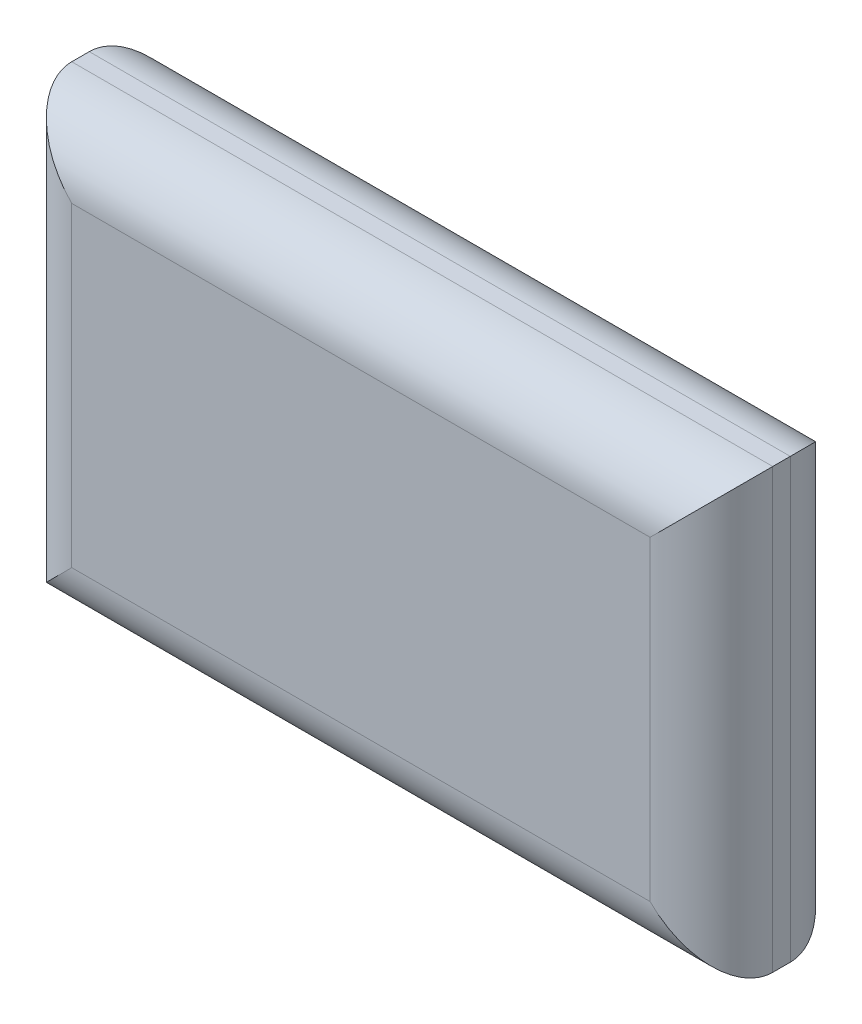
ISO-10303-21;
HEADER;
FILE_DESCRIPTION(('STEP AP214'),'2;1');
FILE_NAME('part.step','',(''),(''),'','','');
FILE_SCHEMA(('AUTOMOTIVE_DESIGN { 1 0 10303 214 1 1 1 1 }'));
ENDSEC;
DATA;
#1=APPLICATION_CONTEXT('core data for automotive mechanical design processes');
#2=APPLICATION_PROTOCOL_DEFINITION('international standard','automotive_design',2000,#1);
#3=PRODUCT_CONTEXT('',#1,'mechanical');
#4=PRODUCT('Part','Part','',(#3));
#5=PRODUCT_RELATED_PRODUCT_CATEGORY('part','',(#4));
#6=PRODUCT_DEFINITION_FORMATION('','',#4);
#7=PRODUCT_DEFINITION_CONTEXT('part definition',#1,'design');
#8=PRODUCT_DEFINITION('design','',#6,#7);
#9=PRODUCT_DEFINITION_SHAPE('','',#8);
#10=(LENGTH_UNIT() NAMED_UNIT(*) SI_UNIT(.MILLI.,.METRE.));
#11=(NAMED_UNIT(*) PLANE_ANGLE_UNIT() SI_UNIT($,.RADIAN.));
#12=(NAMED_UNIT(*) SI_UNIT($,.STERADIAN.) SOLID_ANGLE_UNIT());
#13=UNCERTAINTY_MEASURE_WITH_UNIT(LENGTH_MEASURE(1.E-05),#10,'distance_accuracy_value','');
#14=(GEOMETRIC_REPRESENTATION_CONTEXT(3) GLOBAL_UNCERTAINTY_ASSIGNED_CONTEXT((#13)) GLOBAL_UNIT_ASSIGNED_CONTEXT((#10,
#11,#12)) REPRESENTATION_CONTEXT('',''));
#15=CARTESIAN_POINT('',(0.,0.,0.));
#16=DIRECTION('',(0.,0.,1.));
#17=DIRECTION('',(1.,0.,0.));
#18=AXIS2_PLACEMENT_3D('',#15,#16,#17);
#19=CARTESIAN_POINT('',(20.,-12.5,8.));
#20=DIRECTION('',(-1.,0.,0.));
#21=DIRECTION('',(0.,0.,1.));
#22=AXIS2_PLACEMENT_3D('',#19,#20,#21);
#23=PLANE('',#22);
#24=DIRECTION('',(0.,0.,-1.));
#25=VECTOR('',#24,1.);
#26=CARTESIAN_POINT('',(20.,-12.5,8.));
#27=LINE('',#26,#25);
#28=CARTESIAN_POINT('',(20.,-12.5,4.5));
#29=VERTEX_POINT('',#28);
#30=CARTESIAN_POINT('',(20.,-12.5,3.5));
#31=VERTEX_POINT('',#30);
#32=EDGE_CURVE('E194',#29,#31,#27,.T.);
#33=ORIENTED_EDGE('',*,*,#32,.T.);
#34=DIRECTION('',(0.,1.,0.));
#35=VECTOR('',#34,1.);
#36=CARTESIAN_POINT('',(20.,12.5,3.5));
#37=LINE('',#36,#35);
#38=CARTESIAN_POINT('',(20.,12.5,3.5));
#39=VERTEX_POINT('',#38);
#40=EDGE_CURVE('E164',#31,#39,#37,.T.);
#41=ORIENTED_EDGE('',*,*,#40,.T.);
#42=DIRECTION('',(0.,0.,-1.));
#43=VECTOR('',#42,1.);
#44=CARTESIAN_POINT('',(20.,12.5,8.));
#45=LINE('',#44,#43);
#46=CARTESIAN_POINT('',(20.,12.5,4.5));
#47=VERTEX_POINT('',#46);
#48=EDGE_CURVE('E276',#47,#39,#45,.T.);
#49=ORIENTED_EDGE('',*,*,#48,.F.);
#50=DIRECTION('',(0.,1.,0.));
#51=VECTOR('',#50,1.);
#52=CARTESIAN_POINT('',(20.,-12.5,4.5));
#53=LINE('',#52,#51);
#54=EDGE_CURVE('E161',#47,#29,#53,.F.);
#55=ORIENTED_EDGE('',*,*,#54,.T.);
#56=EDGE_LOOP('',(#33,#41,#49,#55));
#57=FACE_BOUND('',#56,.T.);
#58=ADVANCED_FACE('F44',(#57),#23,.F.);
#59=CARTESIAN_POINT('',(-20.,12.5,8.));
#60=DIRECTION('',(0.,-1.,0.));
#61=DIRECTION('',(0.,0.,-1.));
#62=AXIS2_PLACEMENT_3D('',#59,#60,#61);
#63=PLANE('',#62);
#64=ORIENTED_EDGE('',*,*,#48,.T.);
#65=DIRECTION('',(-1.,0.,0.));
#66=VECTOR('',#65,1.);
#67=CARTESIAN_POINT('',(-20.,12.5,3.5));
#68=LINE('',#67,#66);
#69=CARTESIAN_POINT('',(-20.,12.5,3.5));
#70=VERTEX_POINT('',#69);
#71=EDGE_CURVE('E288',#39,#70,#68,.T.);
#72=ORIENTED_EDGE('',*,*,#71,.T.);
#73=DIRECTION('',(0.,0.,-1.));
#74=VECTOR('',#73,1.);
#75=CARTESIAN_POINT('',(-20.,12.5,8.));
#76=LINE('',#75,#74);
#77=CARTESIAN_POINT('',(-20.,12.5,4.5));
#78=VERTEX_POINT('',#77);
#79=EDGE_CURVE('E271',#78,#70,#76,.T.);
#80=ORIENTED_EDGE('',*,*,#79,.F.);
#81=DIRECTION('',(-1.,0.,0.));
#82=VECTOR('',#81,1.);
#83=CARTESIAN_POINT('',(-20.,12.5,4.5));
#84=LINE('',#83,#82);
#85=EDGE_CURVE('E285',#78,#47,#84,.F.);
#86=ORIENTED_EDGE('',*,*,#85,.T.);
#87=EDGE_LOOP('',(#64,#72,#80,#86));
#88=FACE_BOUND('',#87,.T.);
#89=ADVANCED_FACE('F240',(#88),#63,.F.);
#90=CARTESIAN_POINT('',(-20.,-12.5,8.));
#91=DIRECTION('',(1.,0.,0.));
#92=DIRECTION('',(0.,0.,-1.));
#93=AXIS2_PLACEMENT_3D('',#90,#91,#92);
#94=PLANE('',#93);
#95=ORIENTED_EDGE('',*,*,#79,.T.);
#96=DIRECTION('',(0.,-1.,0.));
#97=VECTOR('',#96,1.);
#98=CARTESIAN_POINT('',(-20.,-12.5,3.5));
#99=LINE('',#98,#97);
#100=CARTESIAN_POINT('',(-20.,-12.5,3.5));
#101=VERTEX_POINT('',#100);
#102=EDGE_CURVE('E148',#70,#101,#99,.T.);
#103=ORIENTED_EDGE('',*,*,#102,.T.);
#104=DIRECTION('',(0.,0.,-1.));
#105=VECTOR('',#104,1.);
#106=CARTESIAN_POINT('',(-20.,-12.5,8.));
#107=LINE('',#106,#105);
#108=CARTESIAN_POINT('',(-20.,-12.5,4.5));
#109=VERTEX_POINT('',#108);
#110=EDGE_CURVE('E269',#109,#101,#107,.T.);
#111=ORIENTED_EDGE('',*,*,#110,.F.);
#112=DIRECTION('',(0.,-1.,0.));
#113=VECTOR('',#112,1.);
#114=CARTESIAN_POINT('',(-20.,-12.5,4.5));
#115=LINE('',#114,#113);
#116=EDGE_CURVE('E153',#109,#78,#115,.F.);
#117=ORIENTED_EDGE('',*,*,#116,.T.);
#118=EDGE_LOOP('',(#95,#103,#111,#117));
#119=FACE_BOUND('',#118,.T.);
#120=ADVANCED_FACE('F237',(#119),#94,.F.);
#121=CARTESIAN_POINT('',(-20.,-12.5,8.));
#122=DIRECTION('',(0.,1.,0.));
#123=DIRECTION('',(0.,0.,1.));
#124=AXIS2_PLACEMENT_3D('',#121,#122,#123);
#125=PLANE('',#124);
#126=DIRECTION('',(1.,0.,0.));
#127=VECTOR('',#126,1.);
#128=CARTESIAN_POINT('',(-20.,-12.5,4.5));
#129=LINE('',#128,#127);
#130=CARTESIAN_POINT('',(-18.7669872981078,-12.5,4.5));
#131=VERTEX_POINT('',#130);
#132=EDGE_CURVE('E138',#29,#131,#129,.F.);
#133=ORIENTED_EDGE('',*,*,#132,.T.);
#134=CARTESIAN_POINT('',(-19.2,-12.5,4.75));
#135=DIRECTION('',(0.,-1.,0.));
#136=DIRECTION('',(0.,0.,-1.));
#137=AXIS2_PLACEMENT_3D('',#134,#135,#136);
#138=CIRCLE('',#137,0.499999999999999);
#139=CARTESIAN_POINT('',(-19.6330127018922,-12.5,4.5));
#140=VERTEX_POINT('',#139);
#141=EDGE_CURVE('E71',#140,#131,#138,.T.);
#142=ORIENTED_EDGE('',*,*,#141,.F.);
#143=EDGE_CURVE('E135',#140,#109,#129,.F.);
#144=ORIENTED_EDGE('',*,*,#143,.T.);
#145=ORIENTED_EDGE('',*,*,#110,.T.);
#146=DIRECTION('',(1.,0.,0.));
#147=VECTOR('',#146,1.);
#148=CARTESIAN_POINT('',(20.,-12.5,3.5));
#149=LINE('',#148,#147);
#150=CARTESIAN_POINT('',(-19.6330127018922,-12.5,3.5));
#151=VERTEX_POINT('',#150);
#152=EDGE_CURVE('E157',#101,#151,#149,.T.);
#153=ORIENTED_EDGE('',*,*,#152,.T.);
#154=CARTESIAN_POINT('',(-19.2,-12.5,3.25));
#155=DIRECTION('',(0.,-1.,0.));
#156=DIRECTION('',(0.,0.,1.));
#157=AXIS2_PLACEMENT_3D('',#154,#155,#156);
#158=CIRCLE('',#157,0.499999999999999);
#159=CARTESIAN_POINT('',(-18.7669872981078,-12.5,3.5));
#160=VERTEX_POINT('',#159);
#161=EDGE_CURVE('E64',#160,#151,#158,.T.);
#162=ORIENTED_EDGE('',*,*,#161,.F.);
#163=EDGE_CURVE('E152',#160,#31,#149,.T.);
#164=ORIENTED_EDGE('',*,*,#163,.T.);
#165=ORIENTED_EDGE('',*,*,#32,.F.);
#166=EDGE_LOOP('',(#133,#142,#144,#145,#153,#162,#164,#165));
#167=FACE_BOUND('',#166,.T.);
#168=ADVANCED_FACE('F133',(#167),#125,.F.);
#169=CARTESIAN_POINT('',(0.,0.,8.));
#170=DIRECTION('',(0.,0.,-1.));
#171=DIRECTION('',(-1.,0.,0.));
#172=AXIS2_PLACEMENT_3D('',#169,#170,#171);
#173=PLANE('',#172);
#174=DIRECTION('',(0.,-1.,0.));
#175=VECTOR('',#174,1.);
#176=CARTESIAN_POINT('',(-16.5,0.,8.));
#177=LINE('',#176,#175);
#178=CARTESIAN_POINT('',(-16.5,9.,8.));
#179=VERTEX_POINT('',#178);
#180=CARTESIAN_POINT('',(-16.5,-9.,8.));
#181=VERTEX_POINT('',#180);
#182=EDGE_CURVE('E173',#179,#181,#177,.T.);
#183=ORIENTED_EDGE('',*,*,#182,.T.);
#184=DIRECTION('',(1.,0.,0.));
#185=VECTOR('',#184,1.);
#186=CARTESIAN_POINT('',(0.,-9.,8.));
#187=LINE('',#186,#185);
#188=CARTESIAN_POINT('',(16.5,-9.,8.));
#189=VERTEX_POINT('',#188);
#190=EDGE_CURVE('E131',#181,#189,#187,.T.);
#191=ORIENTED_EDGE('',*,*,#190,.T.);
#192=DIRECTION('',(0.,1.,0.));
#193=VECTOR('',#192,1.);
#194=CARTESIAN_POINT('',(16.5,0.,8.));
#195=LINE('',#194,#193);
#196=CARTESIAN_POINT('',(16.5,9.,8.));
#197=VERTEX_POINT('',#196);
#198=EDGE_CURVE('E167',#189,#197,#195,.T.);
#199=ORIENTED_EDGE('',*,*,#198,.T.);
#200=DIRECTION('',(-1.,0.,0.));
#201=VECTOR('',#200,1.);
#202=CARTESIAN_POINT('',(0.,9.,8.));
#203=LINE('',#202,#201);
#204=EDGE_CURVE('E170',#197,#179,#203,.T.);
#205=ORIENTED_EDGE('',*,*,#204,.T.);
#206=EDGE_LOOP('',(#183,#191,#199,#205));
#207=FACE_BOUND('',#206,.T.);
#208=ADVANCED_FACE('F226',(#207),#173,.F.);
#209=CARTESIAN_POINT('',(0.,0.,0.));
#210=DIRECTION('',(0.,0.,-1.));
#211=DIRECTION('',(-1.,0.,0.));
#212=AXIS2_PLACEMENT_3D('',#209,#210,#211);
#213=PLANE('',#212);
#214=DIRECTION('',(0.,-1.,0.));
#215=VECTOR('',#214,1.);
#216=CARTESIAN_POINT('',(-16.5,12.5,0.));
#217=LINE('',#216,#215);
#218=CARTESIAN_POINT('',(-16.5,-9.,0.));
#219=VERTEX_POINT('',#218);
#220=CARTESIAN_POINT('',(-16.5,9.,0.));
#221=VERTEX_POINT('',#220);
#222=EDGE_CURVE('E298',#219,#221,#217,.F.);
#223=ORIENTED_EDGE('',*,*,#222,.T.);
#224=DIRECTION('',(-1.,0.,0.));
#225=VECTOR('',#224,1.);
#226=CARTESIAN_POINT('',(20.,9.,0.));
#227=LINE('',#226,#225);
#228=CARTESIAN_POINT('',(16.5,9.,0.));
#229=VERTEX_POINT('',#228);
#230=EDGE_CURVE('E301',#221,#229,#227,.F.);
#231=ORIENTED_EDGE('',*,*,#230,.T.);
#232=DIRECTION('',(0.,1.,0.));
#233=VECTOR('',#232,1.);
#234=CARTESIAN_POINT('',(16.5,-12.5,0.));
#235=LINE('',#234,#233);
#236=CARTESIAN_POINT('',(16.5,-9.,0.));
#237=VERTEX_POINT('',#236);
#238=EDGE_CURVE('E292',#229,#237,#235,.F.);
#239=ORIENTED_EDGE('',*,*,#238,.T.);
#240=DIRECTION('',(1.,0.,0.));
#241=VECTOR('',#240,1.);
#242=CARTESIAN_POINT('',(-20.,-9.,0.));
#243=LINE('',#242,#241);
#244=EDGE_CURVE('E295',#237,#219,#243,.F.);
#245=ORIENTED_EDGE('',*,*,#244,.T.);
#246=EDGE_LOOP('',(#223,#231,#239,#245));
#247=FACE_BOUND('',#246,.T.);
#248=ADVANCED_FACE('F229',(#247),#213,.T.);
#249=CARTESIAN_POINT('',(-20.,-9.,3.5));
#250=DIRECTION('',(-1.,0.,0.));
#251=DIRECTION('',(0.,0.,1.));
#252=AXIS2_PLACEMENT_3D('',#249,#250,#251);
#253=CYLINDRICAL_SURFACE('',#252,3.5);
#254=CARTESIAN_POINT('',(-19.6330127018922,-12.5,3.5));
#255=CARTESIAN_POINT('',(-19.6469928904965,-12.5000107375546,3.47583576820222));
#256=CARTESIAN_POINT('',(-19.6589030963761,-12.4997504644326,3.45048342649911));
#257=CARTESIAN_POINT('',(-19.6783410385018,-12.4986136620499,3.39819041148637));
#258=CARTESIAN_POINT('',(-19.6858729234412,-12.4977377179152,3.37125126850695));
#259=CARTESIAN_POINT('',(-19.6963418793736,-12.4952950025465,3.31650943883713));
#260=CARTESIAN_POINT('',(-19.6992765411798,-12.4937278696442,3.28870630714897));
#261=CARTESIAN_POINT('',(-19.7004867192572,-12.4899162270384,3.23305198474433));
#262=CARTESIAN_POINT('',(-19.69876305555,-12.4876718366166,3.20520080334875));
#263=CARTESIAN_POINT('',(-19.6907228829065,-12.4825830588561,3.1501700802428));
#264=CARTESIAN_POINT('',(-19.6843972565171,-12.479737488407,3.12299198274739));
#265=CARTESIAN_POINT('',(-19.6673428091999,-12.4736001187119,3.07010274293175));
#266=CARTESIAN_POINT('',(-19.6566129143552,-12.4703082107642,3.04439196013772));
#267=CARTESIAN_POINT('',(-19.6308956745521,-12.4634411488062,2.99481673427922));
#268=CARTESIAN_POINT('',(-19.6158562215866,-12.4598629401037,2.97097974185353));
#269=CARTESIAN_POINT('',(-19.5819936914619,-12.4527131608707,2.9261641258474));
#270=CARTESIAN_POINT('',(-19.5631705911017,-12.4491415903812,2.90518551979568));
#271=CARTESIAN_POINT('',(-19.5220666485187,-12.4422465200099,2.86649450760369));
#272=CARTESIAN_POINT('',(-19.4997573660102,-12.438925427161,2.84881185334408));
#273=CARTESIAN_POINT('',(-19.452410226329,-12.432839696143,2.81745500590771));
#274=CARTESIAN_POINT('',(-19.4273724712264,-12.4300750371693,2.80378066285387));
#275=CARTESIAN_POINT('',(-19.3755390374428,-12.4253679544126,2.78098035107366));
#276=CARTESIAN_POINT('',(-19.3487639193547,-12.4234174230804,2.77180936486066));
#277=CARTESIAN_POINT('',(-19.2940023374874,-12.4204740608831,2.75810582203098));
#278=CARTESIAN_POINT('',(-19.2660160589793,-12.4194810840781,2.75357255857754));
#279=CARTESIAN_POINT('',(-19.2102442126642,-12.4185542468073,2.74933932902496));
#280=CARTESIAN_POINT('',(-19.182466369373,-12.4185990082184,2.74954180421964));
#281=CARTESIAN_POINT('',(-19.1273472930968,-12.4196908853582,2.75453328669916));
#282=CARTESIAN_POINT('',(-19.1000060412305,-12.4207379576197,2.75932209508887));
#283=CARTESIAN_POINT('',(-19.0467089371264,-12.4237314571602,2.77328619166973));
#284=CARTESIAN_POINT('',(-19.0207453762407,-12.4256721191536,2.7824333733597));
#285=CARTESIAN_POINT('',(-18.9707199232783,-12.4302857142523,2.80482383782557));
#286=CARTESIAN_POINT('',(-18.9466581969322,-12.4329587110847,2.81806747708382));
#287=CARTESIAN_POINT('',(-18.9007099492567,-12.4388660994291,2.84850693230484));
#288=CARTESIAN_POINT('',(-18.8788630906254,-12.4421085775749,2.86576102657782));
#289=CARTESIAN_POINT('',(-18.8383486330841,-12.4488698388606,2.90362267891416));
#290=CARTESIAN_POINT('',(-18.8196813784145,-12.4523886518578,2.92423059960857));
#291=CARTESIAN_POINT('',(-18.7856984329338,-12.4595079061748,2.96866230973304));
#292=CARTESIAN_POINT('',(-18.7704519411057,-12.4631086434877,2.99253902770524));
#293=CARTESIAN_POINT('',(-18.744190969413,-12.470068517506,3.04254934186663));
#294=CARTESIAN_POINT('',(-18.7331765077401,-12.4734276531728,3.06868294775666));
#295=CARTESIAN_POINT('',(-18.7156929531793,-12.4796910870008,3.12252796661186));
#296=CARTESIAN_POINT('',(-18.7092309570668,-12.4825946695545,3.15024177055945));
#297=CARTESIAN_POINT('',(-18.7010944508563,-12.4877800199017,3.20642574269923));
#298=CARTESIAN_POINT('',(-18.6994203149378,-12.490061739083,3.2348959698317));
#299=CARTESIAN_POINT('',(-18.7009254288105,-12.4938916251141,3.29139999593086));
#300=CARTESIAN_POINT('',(-18.7040450292166,-12.4954484984544,3.31943484435115));
#301=CARTESIAN_POINT('',(-18.7149597702589,-12.4978614182343,3.37459716294711));
#302=CARTESIAN_POINT('',(-18.722750154842,-12.4987181754769,3.40172552653111));
#303=CARTESIAN_POINT('',(-18.7374922300172,-12.4995154322744,3.44043297413263));
#304=CARTESIAN_POINT('',(-18.7427293512548,-12.4997008398344,3.45268466478413));
#305=CARTESIAN_POINT('',(-18.754153807097,-12.4999430739934,3.47671022559556));
#306=CARTESIAN_POINT('',(-18.7603393632532,-12.5000001381794,3.48848493896475));
#307=CARTESIAN_POINT('',(-18.7669872981078,-12.5,3.50000000000001));
#308=B_SPLINE_CURVE_WITH_KNOTS('',3,(#254,#255,#256,#257,#258,#259,#260,#261,#262,#263,#264,
#265,#266,#267,#268,#269,#270,#271,#272,#273,#274,#275,#276,#277,#278,#279,#280,#281,#282,#283,
#284,#285,#286,#287,#288,#289,#290,#291,#292,#293,#294,#295,#296,#297,#298,#299,#300,#301,#302,
#303,#304,#305,#306,#307),.UNSPECIFIED.,.F.,.F.,(4,2,2,2,2,2,2,2,2,2,2,2,2,2,2,2,2,2,2,2,2,2,2,
2,2,2,4),(0.,0.0836409321856888,0.167202480377552,0.250807804586286,0.33439841241238,
0.418155083333663,0.501932189245473,0.586768409035443,0.671605149050092,0.757174080492652,
0.842739811969562,0.927431836067676,1.01211095030441,1.09504719618181,1.17797984553278,
1.26038476754576,1.34279686262687,1.42649103163832,1.5101942560652,1.59546266850514,
1.68073144747433,1.76613285837537,1.85154094335994,1.93589485233884,2.0201630129917,
2.06010257099922,2.09996813251456),.UNSPECIFIED.);
#309=EDGE_CURVE('E11',#151,#160,#308,.T.);
#310=ORIENTED_EDGE('',*,*,#309,.F.);
#311=ORIENTED_EDGE('',*,*,#152,.F.);
#312=CARTESIAN_POINT('',(-16.5,-9.,3.5));
#313=DIRECTION('',(-0.707106781186547,0.707106781186547,0.));
#314=DIRECTION('',(-0.707106781186547,-0.707106781186547,0.));
#315=AXIS2_PLACEMENT_3D('',#312,#313,#314);
#316=ELLIPSE('',#315,4.94974746830583,3.5);
#317=EDGE_CURVE('E186',#219,#101,#316,.T.);
#318=ORIENTED_EDGE('',*,*,#317,.F.);
#319=ORIENTED_EDGE('',*,*,#244,.F.);
#320=CARTESIAN_POINT('',(16.5,-9.,3.5));
#321=DIRECTION('',(-0.707106781186547,-0.707106781186547,0.));
#322=DIRECTION('',(0.707106781186547,-0.707106781186547,0.));
#323=AXIS2_PLACEMENT_3D('',#320,#321,#322);
#324=ELLIPSE('',#323,4.94974746830583,3.5);
#325=EDGE_CURVE('E190',#31,#237,#324,.F.);
#326=ORIENTED_EDGE('',*,*,#325,.F.);
#327=ORIENTED_EDGE('',*,*,#163,.F.);
#328=EDGE_LOOP('',(#310,#311,#318,#319,#326,#327));
#329=FACE_BOUND('',#328,.T.);
#330=ADVANCED_FACE('F233',(#329),#253,.T.);
#331=CARTESIAN_POINT('',(16.5,-12.5,3.5));
#332=DIRECTION('',(0.,-1.,0.));
#333=DIRECTION('',(0.,0.,-1.));
#334=AXIS2_PLACEMENT_3D('',#331,#332,#333);
#335=CYLINDRICAL_SURFACE('',#334,3.5);
#336=ORIENTED_EDGE('',*,*,#325,.T.);
#337=ORIENTED_EDGE('',*,*,#238,.F.);
#338=CARTESIAN_POINT('',(16.5,9.,3.5));
#339=DIRECTION('',(0.707106781186547,-0.707106781186547,0.));
#340=DIRECTION('',(-0.707106781186547,-0.707106781186547,0.));
#341=AXIS2_PLACEMENT_3D('',#338,#339,#340);
#342=ELLIPSE('',#341,4.94974746830583,3.5);
#343=EDGE_CURVE('E182',#39,#229,#342,.F.);
#344=ORIENTED_EDGE('',*,*,#343,.F.);
#345=ORIENTED_EDGE('',*,*,#40,.F.);
#346=EDGE_LOOP('',(#336,#337,#344,#345));
#347=FACE_BOUND('',#346,.T.);
#348=ADVANCED_FACE('F255',(#347),#335,.T.);
#349=CARTESIAN_POINT('',(-16.5,-12.5,3.5));
#350=DIRECTION('',(0.,1.,0.));
#351=DIRECTION('',(0.,0.,1.));
#352=AXIS2_PLACEMENT_3D('',#349,#350,#351);
#353=CYLINDRICAL_SURFACE('',#352,3.5);
#354=ORIENTED_EDGE('',*,*,#317,.T.);
#355=ORIENTED_EDGE('',*,*,#102,.F.);
#356=CARTESIAN_POINT('',(-16.5,9.,3.5));
#357=DIRECTION('',(0.707106781186547,0.707106781186547,0.));
#358=DIRECTION('',(-0.707106781186547,0.707106781186547,0.));
#359=AXIS2_PLACEMENT_3D('',#356,#357,#358);
#360=ELLIPSE('',#359,4.94974746830583,3.5);
#361=EDGE_CURVE('E179',#221,#70,#360,.T.);
#362=ORIENTED_EDGE('',*,*,#361,.F.);
#363=ORIENTED_EDGE('',*,*,#222,.F.);
#364=EDGE_LOOP('',(#354,#355,#362,#363));
#365=FACE_BOUND('',#364,.T.);
#366=ADVANCED_FACE('F251',(#365),#353,.T.);
#367=CARTESIAN_POINT('',(-20.,9.,3.5));
#368=DIRECTION('',(1.,0.,0.));
#369=DIRECTION('',(0.,0.,-1.));
#370=AXIS2_PLACEMENT_3D('',#367,#368,#369);
#371=CYLINDRICAL_SURFACE('',#370,3.5);
#372=ORIENTED_EDGE('',*,*,#343,.T.);
#373=ORIENTED_EDGE('',*,*,#230,.F.);
#374=ORIENTED_EDGE('',*,*,#361,.T.);
#375=ORIENTED_EDGE('',*,*,#71,.F.);
#376=EDGE_LOOP('',(#372,#373,#374,#375));
#377=FACE_BOUND('',#376,.T.);
#378=ADVANCED_FACE('F248',(#377),#371,.T.);
#379=CARTESIAN_POINT('',(0.,9.,4.5));
#380=DIRECTION('',(-1.,0.,0.));
#381=DIRECTION('',(0.,0.,1.));
#382=AXIS2_PLACEMENT_3D('',#379,#380,#381);
#383=CYLINDRICAL_SURFACE('',#382,3.5);
#384=CARTESIAN_POINT('',(16.5,9.,4.5));
#385=DIRECTION('',(-0.707106781186547,0.707106781186547,0.));
#386=DIRECTION('',(0.707106781186547,0.707106781186547,0.));
#387=AXIS2_PLACEMENT_3D('',#384,#385,#386);
#388=ELLIPSE('',#387,4.94974746830583,3.5);
#389=EDGE_CURVE('E200',#47,#197,#388,.F.);
#390=ORIENTED_EDGE('',*,*,#389,.F.);
#391=ORIENTED_EDGE('',*,*,#85,.F.);
#392=CARTESIAN_POINT('',(-16.5,9.,4.5));
#393=DIRECTION('',(-0.707106781186547,-0.707106781186547,0.));
#394=DIRECTION('',(-0.707106781186547,0.707106781186547,0.));
#395=AXIS2_PLACEMENT_3D('',#392,#393,#394);
#396=ELLIPSE('',#395,4.94974746830583,3.5);
#397=EDGE_CURVE('E183',#179,#78,#396,.T.);
#398=ORIENTED_EDGE('',*,*,#397,.F.);
#399=ORIENTED_EDGE('',*,*,#204,.F.);
#400=EDGE_LOOP('',(#390,#391,#398,#399));
#401=FACE_BOUND('',#400,.T.);
#402=ADVANCED_FACE('F46',(#401),#383,.T.);
#403=CARTESIAN_POINT('',(-16.5,0.,4.5));
#404=DIRECTION('',(0.,-1.,0.));
#405=DIRECTION('',(0.,0.,-1.));
#406=AXIS2_PLACEMENT_3D('',#403,#404,#405);
#407=CYLINDRICAL_SURFACE('',#406,3.5);
#408=ORIENTED_EDGE('',*,*,#397,.T.);
#409=ORIENTED_EDGE('',*,*,#116,.F.);
#410=CARTESIAN_POINT('',(-16.5,-9.,4.5));
#411=DIRECTION('',(0.707106781186547,-0.707106781186547,0.));
#412=DIRECTION('',(-0.707106781186547,-0.707106781186547,0.));
#413=AXIS2_PLACEMENT_3D('',#410,#411,#412);
#414=ELLIPSE('',#413,4.94974746830583,3.5);
#415=EDGE_CURVE('E145',#181,#109,#414,.T.);
#416=ORIENTED_EDGE('',*,*,#415,.F.);
#417=ORIENTED_EDGE('',*,*,#182,.F.);
#418=EDGE_LOOP('',(#408,#409,#416,#417));
#419=FACE_BOUND('',#418,.T.);
#420=ADVANCED_FACE('F316',(#419),#407,.T.);
#421=CARTESIAN_POINT('',(16.5,0.,4.5));
#422=DIRECTION('',(0.,1.,0.));
#423=DIRECTION('',(0.,0.,1.));
#424=AXIS2_PLACEMENT_3D('',#421,#422,#423);
#425=CYLINDRICAL_SURFACE('',#424,3.5);
#426=ORIENTED_EDGE('',*,*,#389,.T.);
#427=ORIENTED_EDGE('',*,*,#198,.F.);
#428=CARTESIAN_POINT('',(16.5,-9.,4.5));
#429=DIRECTION('',(0.707106781186547,0.707106781186547,0.));
#430=DIRECTION('',(-0.707106781186547,0.707106781186547,0.));
#431=AXIS2_PLACEMENT_3D('',#428,#429,#430);
#432=ELLIPSE('',#431,4.94974746830583,3.5);
#433=EDGE_CURVE('E195',#29,#189,#432,.F.);
#434=ORIENTED_EDGE('',*,*,#433,.F.);
#435=ORIENTED_EDGE('',*,*,#54,.F.);
#436=EDGE_LOOP('',(#426,#427,#434,#435));
#437=FACE_BOUND('',#436,.T.);
#438=ADVANCED_FACE('F319',(#437),#425,.T.);
#439=CARTESIAN_POINT('',(0.,-9.,4.5));
#440=DIRECTION('',(1.,0.,0.));
#441=DIRECTION('',(0.,0.,-1.));
#442=AXIS2_PLACEMENT_3D('',#439,#440,#441);
#443=CYLINDRICAL_SURFACE('',#442,3.5);
#444=CARTESIAN_POINT('',(-18.7669872981078,-12.5,4.5));
#445=CARTESIAN_POINT('',(-18.7530071095035,-12.5000107375546,4.52416423179778));
#446=CARTESIAN_POINT('',(-18.7410969036239,-12.4997504644326,4.54951657350089));
#447=CARTESIAN_POINT('',(-18.7216589614982,-12.4986136620499,4.60180958851364));
#448=CARTESIAN_POINT('',(-18.7141270765588,-12.4977377179152,4.62874873149305));
#449=CARTESIAN_POINT('',(-18.7036581206264,-12.4952950025465,4.68349056116287));
#450=CARTESIAN_POINT('',(-18.7007234588202,-12.4937278696442,4.71129369285103));
#451=CARTESIAN_POINT('',(-18.6995132807428,-12.4899162270384,4.76694801525567));
#452=CARTESIAN_POINT('',(-18.70123694445,-12.4876718366166,4.79479919665125));
#453=CARTESIAN_POINT('',(-18.7092771170935,-12.4825830588561,4.8498299197572));
#454=CARTESIAN_POINT('',(-18.7156027434829,-12.479737488407,4.87700801725261));
#455=CARTESIAN_POINT('',(-18.7326571908001,-12.4736001187119,4.92989725706825));
#456=CARTESIAN_POINT('',(-18.7433870856448,-12.4703082107642,4.95560803986228));
#457=CARTESIAN_POINT('',(-18.7691043254479,-12.4634411488062,5.00518326572078));
#458=CARTESIAN_POINT('',(-18.7841437784134,-12.4598629401037,5.02902025814647));
#459=CARTESIAN_POINT('',(-18.8180063085381,-12.4527131608707,5.0738358741526));
#460=CARTESIAN_POINT('',(-18.8368294088983,-12.4491415903812,5.09481448020432));
#461=CARTESIAN_POINT('',(-18.8779333514813,-12.4422465200099,5.13350549239631));
#462=CARTESIAN_POINT('',(-18.9002426339898,-12.438925427161,5.15118814665592));
#463=CARTESIAN_POINT('',(-18.947589773671,-12.432839696143,5.18254499409229));
#464=CARTESIAN_POINT('',(-18.9726275287736,-12.4300750371693,5.19621933714613));
#465=CARTESIAN_POINT('',(-19.0244609625572,-12.4253679544126,5.21901964892634));
#466=CARTESIAN_POINT('',(-19.0512360806453,-12.4234174230804,5.22819063513934));
#467=CARTESIAN_POINT('',(-19.1059976625126,-12.4204740608831,5.24189417796902));
#468=CARTESIAN_POINT('',(-19.1339839410207,-12.4194810840781,5.24642744142246));
#469=CARTESIAN_POINT('',(-19.1897557873358,-12.4185542468073,5.25066067097504));
#470=CARTESIAN_POINT('',(-19.217533630627,-12.4185990082184,5.25045819578036));
#471=CARTESIAN_POINT('',(-19.2726527069032,-12.4196908853582,5.24546671330084));
#472=CARTESIAN_POINT('',(-19.2999939587695,-12.4207379576197,5.24067790491114));
#473=CARTESIAN_POINT('',(-19.3532910628736,-12.4237314571602,5.22671380833027));
#474=CARTESIAN_POINT('',(-19.3792546237593,-12.4256721191536,5.2175666266403));
#475=CARTESIAN_POINT('',(-19.4292800767217,-12.4302857142523,5.19517616217443));
#476=CARTESIAN_POINT('',(-19.4533418030678,-12.4329587110847,5.18193252291618));
#477=CARTESIAN_POINT('',(-19.4992900507433,-12.4388660994291,5.15149306769516));
#478=CARTESIAN_POINT('',(-19.5211369093746,-12.4421085775749,5.13423897342219));
#479=CARTESIAN_POINT('',(-19.5616513669159,-12.4488698388606,5.09637732108584));
#480=CARTESIAN_POINT('',(-19.5803186215855,-12.4523886518578,5.07576940039143));
#481=CARTESIAN_POINT('',(-19.6143015670662,-12.4595079061748,5.03133769026696));
#482=CARTESIAN_POINT('',(-19.6295480588943,-12.4631086434877,5.00746097229476));
#483=CARTESIAN_POINT('',(-19.655809030587,-12.470068517506,4.95745065813337));
#484=CARTESIAN_POINT('',(-19.6668234922599,-12.4734276531728,4.93131705224334));
#485=CARTESIAN_POINT('',(-19.6843070468207,-12.4796910870008,4.87747203338814));
#486=CARTESIAN_POINT('',(-19.6907690429333,-12.4825946695545,4.84975822944055));
#487=CARTESIAN_POINT('',(-19.6989055491437,-12.4877800199017,4.79357425730077));
#488=CARTESIAN_POINT('',(-19.7005796850622,-12.490061739083,4.7651040301683));
#489=CARTESIAN_POINT('',(-19.6990745711895,-12.4938916251141,4.70860000406914));
#490=CARTESIAN_POINT('',(-19.6959549707834,-12.4954484984544,4.68056515564885));
#491=CARTESIAN_POINT('',(-19.6850402297411,-12.4978614182343,4.62540283705289));
#492=CARTESIAN_POINT('',(-19.677249845158,-12.4987181754769,4.59827447346889));
#493=CARTESIAN_POINT('',(-19.6625077699828,-12.4995154322744,4.55956702586737));
#494=CARTESIAN_POINT('',(-19.6572706487452,-12.4997008398344,4.54731533521587));
#495=CARTESIAN_POINT('',(-19.645846192903,-12.4999430739934,4.52328977440444));
#496=CARTESIAN_POINT('',(-19.6396606367468,-12.5000001381794,4.51151506103525));
#497=CARTESIAN_POINT('',(-19.6330127018923,-12.5,4.49999999999999));
#498=B_SPLINE_CURVE_WITH_KNOTS('',3,(#444,#445,#446,#447,#448,#449,#450,#451,#452,#453,#454,
#455,#456,#457,#458,#459,#460,#461,#462,#463,#464,#465,#466,#467,#468,#469,#470,#471,#472,#473,
#474,#475,#476,#477,#478,#479,#480,#481,#482,#483,#484,#485,#486,#487,#488,#489,#490,#491,#492,
#493,#494,#495,#496,#497),.UNSPECIFIED.,.F.,.F.,(4,2,2,2,2,2,2,2,2,2,2,2,2,2,2,2,2,2,2,2,2,2,2,
2,2,2,4),(0.,0.0836409321856892,0.167202480377552,0.250807804586286,0.334398412412379,
0.418155083333661,0.501932189245472,0.586768409035443,0.671605149050092,0.757174080492651,
0.842739811969562,0.927431836067672,1.01211095030441,1.09504719618181,1.17797984553278,
1.26038476754576,1.34279686262687,1.42649103163831,1.51019425606519,1.59546266850514,
1.68073144747433,1.76613285837537,1.85154094335994,1.93589485233884,2.0201630129917,
2.06010257099922,2.09996813251456),.UNSPECIFIED.);
#499=EDGE_CURVE('E59',#131,#140,#498,.T.);
#500=ORIENTED_EDGE('',*,*,#499,.F.);
#501=ORIENTED_EDGE('',*,*,#132,.F.);
#502=ORIENTED_EDGE('',*,*,#433,.T.);
#503=ORIENTED_EDGE('',*,*,#190,.F.);
#504=ORIENTED_EDGE('',*,*,#415,.T.);
#505=ORIENTED_EDGE('',*,*,#143,.F.);
#506=EDGE_LOOP('',(#500,#501,#502,#503,#504,#505));
#507=FACE_BOUND('',#506,.T.);
#508=ADVANCED_FACE('F142',(#507),#443,.T.);
#509=CARTESIAN_POINT('',(-19.2,-10.5,4.75));
#510=DIRECTION('',(0.,-1.,0.));
#511=DIRECTION('',(0.,0.,-1.));
#512=AXIS2_PLACEMENT_3D('',#509,#510,#511);
#513=CYLINDRICAL_SURFACE('',#512,0.499999999999999);
#514=ORIENTED_EDGE('',*,*,#499,.T.);
#515=ORIENTED_EDGE('',*,*,#141,.T.);
#516=EDGE_LOOP('',(#514,#515));
#517=FACE_BOUND('',#516,.T.);
#518=CARTESIAN_POINT('',(-19.2,-10.5,4.75));
#519=DIRECTION('',(0.,-1.,0.));
#520=DIRECTION('',(0.,0.,-1.));
#521=AXIS2_PLACEMENT_3D('',#518,#519,#520);
#522=CIRCLE('',#521,0.499999999999999);
#523=CARTESIAN_POINT('',(-19.2,-10.5,4.25));
#524=VERTEX_POINT('',#523);
#525=EDGE_CURVE('E140',#524,#524,#522,.T.);
#526=ORIENTED_EDGE('',*,*,#525,.F.);
#527=EDGE_LOOP('',(#526));
#528=FACE_BOUND('',#527,.T.);
#529=ADVANCED_FACE('F124',(#517,#528),#513,.F.);
#530=CARTESIAN_POINT('',(-19.2,-10.5,4.75));
#531=DIRECTION('',(0.,-1.,0.));
#532=DIRECTION('',(0.,0.,-1.));
#533=AXIS2_PLACEMENT_3D('',#530,#531,#532);
#534=PLANE('',#533);
#535=ORIENTED_EDGE('',*,*,#525,.T.);
#536=EDGE_LOOP('',(#535));
#537=FACE_BOUND('',#536,.T.);
#538=ADVANCED_FACE('F217',(#537),#534,.T.);
#539=CARTESIAN_POINT('',(-19.2,-10.5,3.25));
#540=DIRECTION('',(0.,-1.,0.));
#541=DIRECTION('',(0.,0.,-1.));
#542=AXIS2_PLACEMENT_3D('',#539,#540,#541);
#543=CYLINDRICAL_SURFACE('',#542,0.499999999999999);
#544=ORIENTED_EDGE('',*,*,#309,.T.);
#545=ORIENTED_EDGE('',*,*,#161,.T.);
#546=EDGE_LOOP('',(#544,#545));
#547=FACE_BOUND('',#546,.T.);
#548=CARTESIAN_POINT('',(-19.2,-10.5,3.25));
#549=DIRECTION('',(0.,-1.,0.));
#550=DIRECTION('',(0.,0.,1.));
#551=AXIS2_PLACEMENT_3D('',#548,#549,#550);
#552=CIRCLE('',#551,0.499999999999999);
#553=CARTESIAN_POINT('',(-19.2,-10.5,3.75));
#554=VERTEX_POINT('',#553);
#555=EDGE_CURVE('E492',#554,#554,#552,.T.);
#556=ORIENTED_EDGE('',*,*,#555,.F.);
#557=EDGE_LOOP('',(#556));
#558=FACE_BOUND('',#557,.T.);
#559=ADVANCED_FACE('F218',(#547,#558),#543,.F.);
#560=CARTESIAN_POINT('',(-19.2,-10.5,3.25));
#561=DIRECTION('',(0.,1.,0.));
#562=DIRECTION('',(0.,0.,1.));
#563=AXIS2_PLACEMENT_3D('',#560,#561,#562);
#564=PLANE('',#563);
#565=ORIENTED_EDGE('',*,*,#555,.T.);
#566=EDGE_LOOP('',(#565));
#567=FACE_BOUND('',#566,.T.);
#568=ADVANCED_FACE('F222',(#567),#564,.F.);
#569=CLOSED_SHELL('',(#58,#89,#120,#168,#208,#248,#330,#348,#366,#378,#402,#420,#438,#508,#529,
#538,#559,#568));
#570=MANIFOLD_SOLID_BREP('B2',#569);
#571=ADVANCED_BREP_SHAPE_REPRESENTATION('',(#18,#570),#14);
#572=SHAPE_DEFINITION_REPRESENTATION(#9,#571);
ENDSEC;
END-ISO-10303-21;
